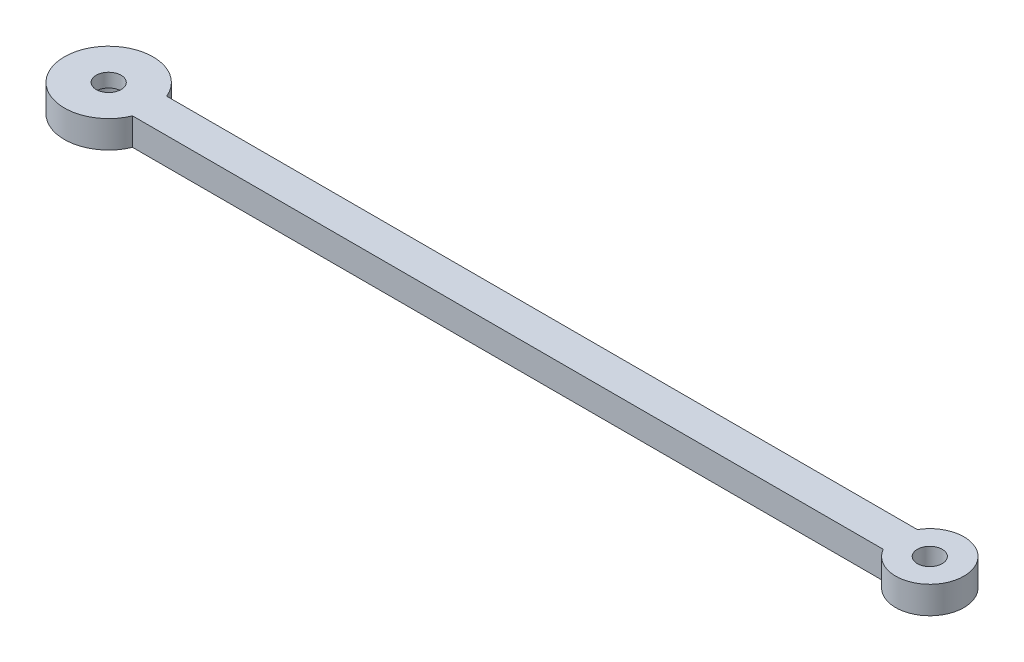
ISO-10303-21;
HEADER;
FILE_DESCRIPTION(('STEP AP214'),'2;1');
FILE_NAME('part.step','',(''),(''),'','','');
FILE_SCHEMA(('AUTOMOTIVE_DESIGN { 1 0 10303 214 1 1 1 1 }'));
ENDSEC;
DATA;
#1=APPLICATION_CONTEXT('core data for automotive mechanical design processes');
#2=APPLICATION_PROTOCOL_DEFINITION('international standard','automotive_design',2000,#1);
#3=PRODUCT_CONTEXT('',#1,'mechanical');
#4=PRODUCT('Part','Part','',(#3));
#5=PRODUCT_RELATED_PRODUCT_CATEGORY('part','',(#4));
#6=PRODUCT_DEFINITION_FORMATION('','',#4);
#7=PRODUCT_DEFINITION_CONTEXT('part definition',#1,'design');
#8=PRODUCT_DEFINITION('design','',#6,#7);
#9=PRODUCT_DEFINITION_SHAPE('','',#8);
#10=(LENGTH_UNIT() NAMED_UNIT(*) SI_UNIT(.MILLI.,.METRE.));
#11=(NAMED_UNIT(*) PLANE_ANGLE_UNIT() SI_UNIT($,.RADIAN.));
#12=(NAMED_UNIT(*) SI_UNIT($,.STERADIAN.) SOLID_ANGLE_UNIT());
#13=UNCERTAINTY_MEASURE_WITH_UNIT(LENGTH_MEASURE(1.E-05),#10,'distance_accuracy_value','');
#14=(GEOMETRIC_REPRESENTATION_CONTEXT(3) GLOBAL_UNCERTAINTY_ASSIGNED_CONTEXT((#13)) GLOBAL_UNIT_ASSIGNED_CONTEXT((#10,
#11,#12)) REPRESENTATION_CONTEXT('',''));
#15=CARTESIAN_POINT('',(0.,0.,0.));
#16=DIRECTION('',(0.,0.,1.));
#17=DIRECTION('',(1.,0.,0.));
#18=AXIS2_PLACEMENT_3D('',#15,#16,#17);
#19=CARTESIAN_POINT('',(-61.,4.,0.));
#20=DIRECTION('',(0.,-1.,0.));
#21=DIRECTION('',(0.,0.,-1.));
#22=AXIS2_PLACEMENT_3D('',#19,#20,#21);
#23=CYLINDRICAL_SURFACE('',#22,6.5);
#24=CARTESIAN_POINT('',(-61.,0.,0.));
#25=DIRECTION('',(0.,1.,0.));
#26=DIRECTION('',(0.,0.,1.));
#27=AXIS2_PLACEMENT_3D('',#24,#25,#26);
#28=CIRCLE('',#27,6.5);
#29=CARTESIAN_POINT('',(-55.,0.,-2.5));
#30=VERTEX_POINT('',#29);
#31=CARTESIAN_POINT('',(-55.,0.,2.5));
#32=VERTEX_POINT('',#31);
#33=EDGE_CURVE('E97',#30,#32,#28,.T.);
#34=ORIENTED_EDGE('',*,*,#33,.T.);
#35=DIRECTION('',(0.,-1.,0.));
#36=VECTOR('',#35,1.);
#37=CARTESIAN_POINT('',(-55.,4.,2.5));
#38=LINE('',#37,#36);
#39=CARTESIAN_POINT('',(-55.,4.,2.5));
#40=VERTEX_POINT('',#39);
#41=EDGE_CURVE('E11',#40,#32,#38,.T.);
#42=ORIENTED_EDGE('',*,*,#41,.F.);
#43=CARTESIAN_POINT('',(-61.,4.,0.));
#44=DIRECTION('',(0.,1.,0.));
#45=DIRECTION('',(0.,0.,1.));
#46=AXIS2_PLACEMENT_3D('',#43,#44,#45);
#47=CIRCLE('',#46,6.5);
#48=CARTESIAN_POINT('',(-55.,4.,-2.5));
#49=VERTEX_POINT('',#48);
#50=EDGE_CURVE('E84',#49,#40,#47,.T.);
#51=ORIENTED_EDGE('',*,*,#50,.F.);
#52=DIRECTION('',(0.,-1.,0.));
#53=VECTOR('',#52,1.);
#54=CARTESIAN_POINT('',(-55.,4.,-2.5));
#55=LINE('',#54,#53);
#56=EDGE_CURVE('E93',#49,#30,#55,.T.);
#57=ORIENTED_EDGE('',*,*,#56,.T.);
#58=EDGE_LOOP('',(#34,#42,#51,#57));
#59=FACE_BOUND('',#58,.T.);
#60=ADVANCED_FACE('F32',(#59),#23,.T.);
#61=CARTESIAN_POINT('',(-55.,4.,2.5));
#62=DIRECTION('',(0.,0.,-1.));
#63=DIRECTION('',(-1.,0.,0.));
#64=AXIS2_PLACEMENT_3D('',#61,#62,#63);
#65=PLANE('',#64);
#66=DIRECTION('',(1.,0.,0.));
#67=VECTOR('',#66,1.);
#68=CARTESIAN_POINT('',(-55.,0.,2.5));
#69=LINE('',#68,#67);
#70=CARTESIAN_POINT('',(55.,0.,2.5));
#71=VERTEX_POINT('',#70);
#72=EDGE_CURVE('E88',#32,#71,#69,.T.);
#73=ORIENTED_EDGE('',*,*,#72,.T.);
#74=DIRECTION('',(0.,-1.,0.));
#75=VECTOR('',#74,1.);
#76=CARTESIAN_POINT('',(55.,4.,2.5));
#77=LINE('',#76,#75);
#78=CARTESIAN_POINT('',(55.,4.,2.5));
#79=VERTEX_POINT('',#78);
#80=EDGE_CURVE('E41',#79,#71,#77,.T.);
#81=ORIENTED_EDGE('',*,*,#80,.F.);
#82=DIRECTION('',(1.,0.,0.));
#83=VECTOR('',#82,1.);
#84=CARTESIAN_POINT('',(-55.,4.,2.5));
#85=LINE('',#84,#83);
#86=EDGE_CURVE('E79',#40,#79,#85,.T.);
#87=ORIENTED_EDGE('',*,*,#86,.F.);
#88=ORIENTED_EDGE('',*,*,#41,.T.);
#89=EDGE_LOOP('',(#73,#81,#87,#88));
#90=FACE_BOUND('',#89,.T.);
#91=ADVANCED_FACE('F87',(#90),#65,.F.);
#92=CARTESIAN_POINT('',(59.3301270189222,4.,0.));
#93=DIRECTION('',(0.,-1.,0.));
#94=DIRECTION('',(0.,0.,-1.));
#95=AXIS2_PLACEMENT_3D('',#92,#93,#94);
#96=CYLINDRICAL_SURFACE('',#95,5.);
#97=CARTESIAN_POINT('',(59.3301270189222,0.,0.));
#98=DIRECTION('',(0.,1.,0.));
#99=DIRECTION('',(0.,0.,-1.));
#100=AXIS2_PLACEMENT_3D('',#97,#98,#99);
#101=CIRCLE('',#100,5.);
#102=CARTESIAN_POINT('',(55.,0.,-2.5));
#103=VERTEX_POINT('',#102);
#104=EDGE_CURVE('E66',#71,#103,#101,.T.);
#105=ORIENTED_EDGE('',*,*,#104,.T.);
#106=DIRECTION('',(0.,-1.,0.));
#107=VECTOR('',#106,1.);
#108=CARTESIAN_POINT('',(55.,4.,-2.5));
#109=LINE('',#108,#107);
#110=CARTESIAN_POINT('',(55.,4.,-2.5));
#111=VERTEX_POINT('',#110);
#112=EDGE_CURVE('E89',#111,#103,#109,.T.);
#113=ORIENTED_EDGE('',*,*,#112,.F.);
#114=CARTESIAN_POINT('',(59.3301270189222,4.,0.));
#115=DIRECTION('',(0.,1.,0.));
#116=DIRECTION('',(0.,0.,-1.));
#117=AXIS2_PLACEMENT_3D('',#114,#115,#116);
#118=CIRCLE('',#117,5.);
#119=EDGE_CURVE('E82',#79,#111,#118,.T.);
#120=ORIENTED_EDGE('',*,*,#119,.F.);
#121=ORIENTED_EDGE('',*,*,#80,.T.);
#122=EDGE_LOOP('',(#105,#113,#120,#121));
#123=FACE_BOUND('',#122,.T.);
#124=ADVANCED_FACE('F91',(#123),#96,.T.);
#125=CARTESIAN_POINT('',(-55.,4.,-2.5));
#126=DIRECTION('',(0.,0.,1.));
#127=DIRECTION('',(1.,0.,0.));
#128=AXIS2_PLACEMENT_3D('',#125,#126,#127);
#129=PLANE('',#128);
#130=DIRECTION('',(-1.,0.,0.));
#131=VECTOR('',#130,1.);
#132=CARTESIAN_POINT('',(-55.,0.,-2.5));
#133=LINE('',#132,#131);
#134=EDGE_CURVE('E72',#103,#30,#133,.T.);
#135=ORIENTED_EDGE('',*,*,#134,.T.);
#136=ORIENTED_EDGE('',*,*,#56,.F.);
#137=DIRECTION('',(-1.,0.,0.));
#138=VECTOR('',#137,1.);
#139=CARTESIAN_POINT('',(-55.,4.,-2.5));
#140=LINE('',#139,#138);
#141=EDGE_CURVE('E49',#111,#49,#140,.T.);
#142=ORIENTED_EDGE('',*,*,#141,.F.);
#143=ORIENTED_EDGE('',*,*,#112,.T.);
#144=EDGE_LOOP('',(#135,#136,#142,#143));
#145=FACE_BOUND('',#144,.T.);
#146=ADVANCED_FACE('F105',(#145),#129,.F.);
#147=CARTESIAN_POINT('',(-61.,4.,0.));
#148=DIRECTION('',(0.,1.,0.));
#149=DIRECTION('',(0.,0.,1.));
#150=AXIS2_PLACEMENT_3D('',#147,#148,#149);
#151=PLANE('',#150);
#152=CARTESIAN_POINT('',(-61.,4.,0.));
#153=DIRECTION('',(0.,1.,0.));
#154=DIRECTION('',(0.,0.,1.));
#155=AXIS2_PLACEMENT_3D('',#152,#153,#154);
#156=CIRCLE('',#155,1.825);
#157=CARTESIAN_POINT('',(-61.,4.,1.825));
#158=VERTEX_POINT('',#157);
#159=EDGE_CURVE('E122',#158,#158,#156,.T.);
#160=ORIENTED_EDGE('',*,*,#159,.F.);
#161=EDGE_LOOP('',(#160));
#162=FACE_BOUND('',#161,.T.);
#163=CARTESIAN_POINT('',(59.3301270189222,4.,0.));
#164=DIRECTION('',(0.,1.,0.));
#165=DIRECTION('',(0.,0.,1.));
#166=AXIS2_PLACEMENT_3D('',#163,#164,#165);
#167=CIRCLE('',#166,1.82499999999999);
#168=CARTESIAN_POINT('',(59.3301270189222,4.,1.82499999999999));
#169=VERTEX_POINT('',#168);
#170=EDGE_CURVE('E116',#169,#169,#167,.T.);
#171=ORIENTED_EDGE('',*,*,#170,.F.);
#172=EDGE_LOOP('',(#171));
#173=FACE_BOUND('',#172,.T.);
#174=ORIENTED_EDGE('',*,*,#50,.T.);
#175=ORIENTED_EDGE('',*,*,#86,.T.);
#176=ORIENTED_EDGE('',*,*,#119,.T.);
#177=ORIENTED_EDGE('',*,*,#141,.T.);
#178=EDGE_LOOP('',(#174,#175,#176,#177));
#179=FACE_BOUND('',#178,.T.);
#180=ADVANCED_FACE('F80',(#162,#173,#179),#151,.T.);
#181=CARTESIAN_POINT('',(-61.,0.,0.));
#182=DIRECTION('',(0.,1.,0.));
#183=DIRECTION('',(0.,0.,1.));
#184=AXIS2_PLACEMENT_3D('',#181,#182,#183);
#185=PLANE('',#184);
#186=CARTESIAN_POINT('',(59.3301270189222,0.,0.));
#187=DIRECTION('',(0.,1.,0.));
#188=DIRECTION('',(0.,0.,1.));
#189=AXIS2_PLACEMENT_3D('',#186,#187,#188);
#190=CIRCLE('',#189,1.82499999999999);
#191=CARTESIAN_POINT('',(59.3301270189222,0.,1.82499999999999));
#192=VERTEX_POINT('',#191);
#193=EDGE_CURVE('E119',#192,#192,#190,.T.);
#194=ORIENTED_EDGE('',*,*,#193,.T.);
#195=EDGE_LOOP('',(#194));
#196=FACE_BOUND('',#195,.T.);
#197=CARTESIAN_POINT('',(-61.,0.,0.));
#198=DIRECTION('',(0.,-1.,0.));
#199=DIRECTION('',(0.,0.,-1.));
#200=AXIS2_PLACEMENT_3D('',#197,#198,#199);
#201=CIRCLE('',#200,3.5);
#202=CARTESIAN_POINT('',(-61.,0.,-3.5));
#203=VERTEX_POINT('',#202);
#204=EDGE_CURVE('E111',#203,#203,#201,.T.);
#205=ORIENTED_EDGE('',*,*,#204,.F.);
#206=EDGE_LOOP('',(#205));
#207=FACE_BOUND('',#206,.T.);
#208=ORIENTED_EDGE('',*,*,#33,.F.);
#209=ORIENTED_EDGE('',*,*,#134,.F.);
#210=ORIENTED_EDGE('',*,*,#104,.F.);
#211=ORIENTED_EDGE('',*,*,#72,.F.);
#212=EDGE_LOOP('',(#208,#209,#210,#211));
#213=FACE_BOUND('',#212,.T.);
#214=ADVANCED_FACE('F108',(#196,#207,#213),#185,.F.);
#215=CARTESIAN_POINT('',(-61.,2.,0.));
#216=DIRECTION('',(0.,-1.,0.));
#217=DIRECTION('',(0.,0.,-1.));
#218=AXIS2_PLACEMENT_3D('',#215,#216,#217);
#219=CYLINDRICAL_SURFACE('',#218,3.5);
#220=CARTESIAN_POINT('',(-61.,2.,0.));
#221=DIRECTION('',(0.,-1.,0.));
#222=DIRECTION('',(0.,0.,-1.));
#223=AXIS2_PLACEMENT_3D('',#220,#221,#222);
#224=CIRCLE('',#223,3.5);
#225=CARTESIAN_POINT('',(-61.,2.,-3.5));
#226=VERTEX_POINT('',#225);
#227=EDGE_CURVE('E100',#226,#226,#224,.T.);
#228=ORIENTED_EDGE('',*,*,#227,.F.);
#229=EDGE_LOOP('',(#228));
#230=FACE_BOUND('',#229,.T.);
#231=ORIENTED_EDGE('',*,*,#204,.T.);
#232=EDGE_LOOP('',(#231));
#233=FACE_BOUND('',#232,.T.);
#234=ADVANCED_FACE('F134',(#230,#233),#219,.F.);
#235=CARTESIAN_POINT('',(-61.,2.,0.));
#236=DIRECTION('',(0.,-1.,0.));
#237=DIRECTION('',(0.,0.,-1.));
#238=AXIS2_PLACEMENT_3D('',#235,#236,#237);
#239=PLANE('',#238);
#240=CARTESIAN_POINT('',(-61.,2.,0.));
#241=DIRECTION('',(0.,-1.,0.));
#242=DIRECTION('',(0.,0.,-1.));
#243=AXIS2_PLACEMENT_3D('',#240,#241,#242);
#244=CIRCLE('',#243,1.825);
#245=CARTESIAN_POINT('',(-61.,2.,-1.825));
#246=VERTEX_POINT('',#245);
#247=EDGE_CURVE('E35',#246,#246,#244,.T.);
#248=ORIENTED_EDGE('',*,*,#247,.F.);
#249=EDGE_LOOP('',(#248));
#250=FACE_BOUND('',#249,.T.);
#251=ORIENTED_EDGE('',*,*,#227,.T.);
#252=EDGE_LOOP('',(#251));
#253=FACE_BOUND('',#252,.T.);
#254=ADVANCED_FACE('F131',(#250,#253),#239,.T.);
#255=CARTESIAN_POINT('',(-61.,0.,0.));
#256=DIRECTION('',(0.,1.,0.));
#257=DIRECTION('',(0.,0.,1.));
#258=AXIS2_PLACEMENT_3D('',#255,#256,#257);
#259=CYLINDRICAL_SURFACE('',#258,1.825);
#260=ORIENTED_EDGE('',*,*,#247,.T.);
#261=EDGE_LOOP('',(#260));
#262=FACE_BOUND('',#261,.T.);
#263=ORIENTED_EDGE('',*,*,#159,.T.);
#264=EDGE_LOOP('',(#263));
#265=FACE_BOUND('',#264,.T.);
#266=ADVANCED_FACE('F129',(#262,#265),#259,.F.);
#267=CARTESIAN_POINT('',(59.3301270189222,0.,0.));
#268=DIRECTION('',(0.,1.,0.));
#269=DIRECTION('',(0.,0.,1.));
#270=AXIS2_PLACEMENT_3D('',#267,#268,#269);
#271=CYLINDRICAL_SURFACE('',#270,1.82499999999999);
#272=ORIENTED_EDGE('',*,*,#193,.F.);
#273=EDGE_LOOP('',(#272));
#274=FACE_BOUND('',#273,.T.);
#275=ORIENTED_EDGE('',*,*,#170,.T.);
#276=EDGE_LOOP('',(#275));
#277=FACE_BOUND('',#276,.T.);
#278=ADVANCED_FACE('F191',(#274,#277),#271,.F.);
#279=CLOSED_SHELL('',(#60,#91,#124,#146,#180,#214,#234,#254,#266,#278));
#280=MANIFOLD_SOLID_BREP('B2',#279);
#281=ADVANCED_BREP_SHAPE_REPRESENTATION('',(#18,#280),#14);
#282=SHAPE_DEFINITION_REPRESENTATION(#9,#281);
ENDSEC;
END-ISO-10303-21;
